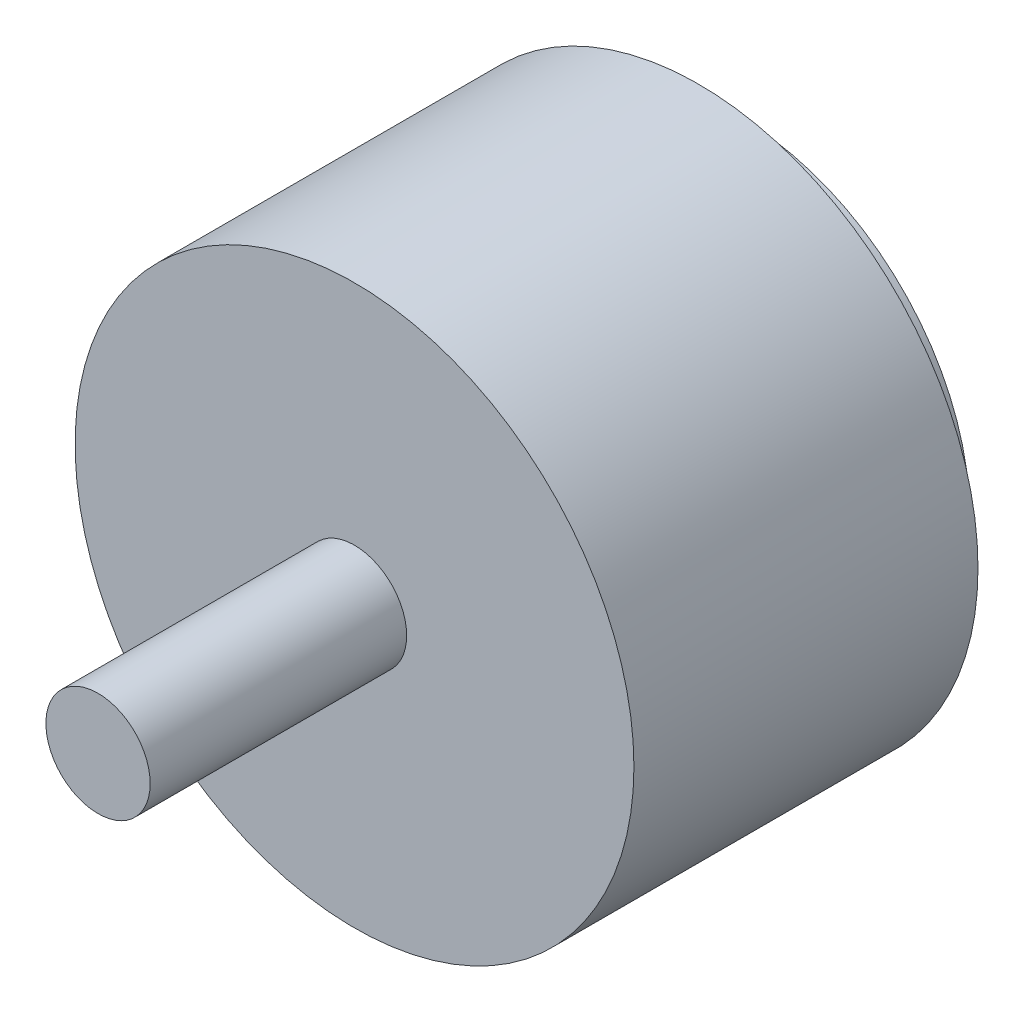
ISO-10303-21;
HEADER;
FILE_DESCRIPTION(('STEP AP214'),'2;1');
FILE_NAME('part.step','',(''),(''),'','','');
FILE_SCHEMA(('AUTOMOTIVE_DESIGN { 1 0 10303 214 1 1 1 1 }'));
ENDSEC;
DATA;
#1=APPLICATION_CONTEXT('core data for automotive mechanical design processes');
#2=APPLICATION_PROTOCOL_DEFINITION('international standard','automotive_design',2000,#1);
#3=PRODUCT_CONTEXT('',#1,'mechanical');
#4=PRODUCT('Part','Part','',(#3));
#5=PRODUCT_RELATED_PRODUCT_CATEGORY('part','',(#4));
#6=PRODUCT_DEFINITION_FORMATION('','',#4);
#7=PRODUCT_DEFINITION_CONTEXT('part definition',#1,'design');
#8=PRODUCT_DEFINITION('design','',#6,#7);
#9=PRODUCT_DEFINITION_SHAPE('','',#8);
#10=(LENGTH_UNIT() NAMED_UNIT(*) SI_UNIT(.MILLI.,.METRE.));
#11=(NAMED_UNIT(*) PLANE_ANGLE_UNIT() SI_UNIT($,.RADIAN.));
#12=(NAMED_UNIT(*) SI_UNIT($,.STERADIAN.) SOLID_ANGLE_UNIT());
#13=UNCERTAINTY_MEASURE_WITH_UNIT(LENGTH_MEASURE(1.E-05),#10,'distance_accuracy_value','');
#14=(GEOMETRIC_REPRESENTATION_CONTEXT(3) GLOBAL_UNCERTAINTY_ASSIGNED_CONTEXT((#13)) GLOBAL_UNIT_ASSIGNED_CONTEXT((#10,
#11,#12)) REPRESENTATION_CONTEXT('',''));
#15=CARTESIAN_POINT('',(0.,0.,0.));
#16=DIRECTION('',(0.,0.,1.));
#17=DIRECTION('',(1.,0.,0.));
#18=AXIS2_PLACEMENT_3D('',#15,#16,#17);
#19=CARTESIAN_POINT('',(0.,0.,16.5));
#20=DIRECTION('',(0.,0.,1.));
#21=DIRECTION('',(1.,0.,0.));
#22=AXIS2_PLACEMENT_3D('',#19,#20,#21);
#23=PLANE('',#22);
#24=CARTESIAN_POINT('',(0.,0.,16.5));
#25=DIRECTION('',(0.,0.,1.));
#26=DIRECTION('',(1.,0.,0.));
#27=AXIS2_PLACEMENT_3D('',#24,#25,#26);
#28=CIRCLE('',#27,2.5);
#29=CARTESIAN_POINT('',(2.5,0.,16.5));
#30=VERTEX_POINT('',#29);
#31=EDGE_CURVE('E10',#30,#30,#28,.T.);
#32=ORIENTED_EDGE('',*,*,#31,.F.);
#33=EDGE_LOOP('',(#32));
#34=FACE_BOUND('',#33,.T.);
#35=CARTESIAN_POINT('',(0.,0.,16.5));
#36=DIRECTION('',(0.,0.,1.));
#37=DIRECTION('',(1.,0.,0.));
#38=AXIS2_PLACEMENT_3D('',#35,#36,#37);
#39=CIRCLE('',#38,13.4);
#40=CARTESIAN_POINT('',(13.4,0.,16.5));
#41=VERTEX_POINT('',#40);
#42=EDGE_CURVE('E49',#41,#41,#39,.T.);
#43=ORIENTED_EDGE('',*,*,#42,.T.);
#44=EDGE_LOOP('',(#43));
#45=FACE_BOUND('',#44,.T.);
#46=ADVANCED_FACE('F40',(#34,#45),#23,.T.);
#47=CARTESIAN_POINT('',(0.,0.,0.));
#48=DIRECTION('',(0.,0.,1.));
#49=DIRECTION('',(1.,0.,0.));
#50=AXIS2_PLACEMENT_3D('',#47,#48,#49);
#51=PLANE('',#50);
#52=CARTESIAN_POINT('',(0.,0.,0.));
#53=DIRECTION('',(0.,0.,1.));
#54=DIRECTION('',(1.,0.,0.));
#55=AXIS2_PLACEMENT_3D('',#52,#53,#54);
#56=CIRCLE('',#55,11.);
#57=CARTESIAN_POINT('',(11.,0.,0.));
#58=VERTEX_POINT('',#57);
#59=EDGE_CURVE('E60',#58,#58,#56,.T.);
#60=ORIENTED_EDGE('',*,*,#59,.T.);
#61=EDGE_LOOP('',(#60));
#62=FACE_BOUND('',#61,.T.);
#63=CARTESIAN_POINT('',(0.,0.,0.));
#64=DIRECTION('',(0.,0.,1.));
#65=DIRECTION('',(1.,0.,0.));
#66=AXIS2_PLACEMENT_3D('',#63,#64,#65);
#67=CIRCLE('',#66,13.4);
#68=CARTESIAN_POINT('',(13.4,0.,0.));
#69=VERTEX_POINT('',#68);
#70=EDGE_CURVE('E54',#69,#69,#67,.T.);
#71=ORIENTED_EDGE('',*,*,#70,.F.);
#72=EDGE_LOOP('',(#71));
#73=FACE_BOUND('',#72,.T.);
#74=ADVANCED_FACE('F72',(#62,#73),#51,.F.);
#75=CARTESIAN_POINT('',(0.,0.,16.5));
#76=DIRECTION('',(0.,0.,-1.));
#77=DIRECTION('',(-1.,0.,0.));
#78=AXIS2_PLACEMENT_3D('',#75,#76,#77);
#79=CYLINDRICAL_SURFACE('',#78,13.4);
#80=ORIENTED_EDGE('',*,*,#42,.F.);
#81=EDGE_LOOP('',(#80));
#82=FACE_BOUND('',#81,.T.);
#83=ORIENTED_EDGE('',*,*,#70,.T.);
#84=EDGE_LOOP('',(#83));
#85=FACE_BOUND('',#84,.T.);
#86=ADVANCED_FACE('F42',(#82,#85),#79,.T.);
#87=CARTESIAN_POINT('',(0.,0.,-2.));
#88=DIRECTION('',(0.,0.,1.));
#89=DIRECTION('',(1.,0.,0.));
#90=AXIS2_PLACEMENT_3D('',#87,#88,#89);
#91=PLANE('',#90);
#92=CARTESIAN_POINT('',(-8.,0.,-2.));
#93=DIRECTION('',(0.,0.,1.));
#94=DIRECTION('',(1.,0.,0.));
#95=AXIS2_PLACEMENT_3D('',#92,#93,#94);
#96=CIRCLE('',#95,1.6);
#97=CARTESIAN_POINT('',(-6.4,0.,-2.));
#98=VERTEX_POINT('',#97);
#99=EDGE_CURVE('E148',#98,#98,#96,.T.);
#100=ORIENTED_EDGE('',*,*,#99,.T.);
#101=EDGE_LOOP('',(#100));
#102=FACE_BOUND('',#101,.T.);
#103=CARTESIAN_POINT('',(0.,-8.,-2.));
#104=DIRECTION('',(0.,0.,1.));
#105=DIRECTION('',(1.,0.,0.));
#106=AXIS2_PLACEMENT_3D('',#103,#104,#105);
#107=CIRCLE('',#106,1.6);
#108=CARTESIAN_POINT('',(1.6,-8.,-2.));
#109=VERTEX_POINT('',#108);
#110=EDGE_CURVE('E152',#109,#109,#107,.T.);
#111=ORIENTED_EDGE('',*,*,#110,.T.);
#112=EDGE_LOOP('',(#111));
#113=FACE_BOUND('',#112,.T.);
#114=CARTESIAN_POINT('',(8.,0.,-2.));
#115=DIRECTION('',(0.,0.,1.));
#116=DIRECTION('',(1.,0.,0.));
#117=AXIS2_PLACEMENT_3D('',#114,#115,#116);
#118=CIRCLE('',#117,1.6);
#119=CARTESIAN_POINT('',(9.6,0.,-2.));
#120=VERTEX_POINT('',#119);
#121=EDGE_CURVE('E160',#120,#120,#118,.T.);
#122=ORIENTED_EDGE('',*,*,#121,.T.);
#123=EDGE_LOOP('',(#122));
#124=FACE_BOUND('',#123,.T.);
#125=CARTESIAN_POINT('',(0.,8.,-2.));
#126=DIRECTION('',(0.,0.,1.));
#127=DIRECTION('',(1.,0.,0.));
#128=AXIS2_PLACEMENT_3D('',#125,#126,#127);
#129=CIRCLE('',#128,1.6);
#130=CARTESIAN_POINT('',(1.6,8.,-2.));
#131=VERTEX_POINT('',#130);
#132=EDGE_CURVE('E166',#131,#131,#129,.T.);
#133=ORIENTED_EDGE('',*,*,#132,.T.);
#134=EDGE_LOOP('',(#133));
#135=FACE_BOUND('',#134,.T.);
#136=CARTESIAN_POINT('',(0.,0.,-2.));
#137=DIRECTION('',(0.,0.,1.));
#138=DIRECTION('',(1.,0.,0.));
#139=AXIS2_PLACEMENT_3D('',#136,#137,#138);
#140=CIRCLE('',#139,11.);
#141=CARTESIAN_POINT('',(11.,0.,-2.));
#142=VERTEX_POINT('',#141);
#143=EDGE_CURVE('E63',#142,#142,#140,.T.);
#144=ORIENTED_EDGE('',*,*,#143,.F.);
#145=EDGE_LOOP('',(#144));
#146=FACE_BOUND('',#145,.T.);
#147=ADVANCED_FACE('F79',(#102,#113,#124,#135,#146),#91,.F.);
#148=CARTESIAN_POINT('',(0.,0.,0.));
#149=DIRECTION('',(0.,0.,-1.));
#150=DIRECTION('',(-1.,0.,0.));
#151=AXIS2_PLACEMENT_3D('',#148,#149,#150);
#152=CYLINDRICAL_SURFACE('',#151,11.);
#153=ORIENTED_EDGE('',*,*,#59,.F.);
#154=EDGE_LOOP('',(#153));
#155=FACE_BOUND('',#154,.T.);
#156=ORIENTED_EDGE('',*,*,#143,.T.);
#157=EDGE_LOOP('',(#156));
#158=FACE_BOUND('',#157,.T.);
#159=ADVANCED_FACE('F94',(#155,#158),#152,.T.);
#160=CARTESIAN_POINT('',(0.,0.,28.8));
#161=DIRECTION('',(0.,0.,-1.));
#162=DIRECTION('',(-1.,0.,0.));
#163=AXIS2_PLACEMENT_3D('',#160,#161,#162);
#164=CYLINDRICAL_SURFACE('',#163,2.5);
#165=CARTESIAN_POINT('',(0.,0.,28.8));
#166=DIRECTION('',(0.,0.,1.));
#167=DIRECTION('',(1.,0.,0.));
#168=AXIS2_PLACEMENT_3D('',#165,#166,#167);
#169=CIRCLE('',#168,2.5);
#170=CARTESIAN_POINT('',(2.5,0.,28.8));
#171=VERTEX_POINT('',#170);
#172=EDGE_CURVE('E58',#171,#171,#169,.T.);
#173=ORIENTED_EDGE('',*,*,#172,.F.);
#174=EDGE_LOOP('',(#173));
#175=FACE_BOUND('',#174,.T.);
#176=ORIENTED_EDGE('',*,*,#31,.T.);
#177=EDGE_LOOP('',(#176));
#178=FACE_BOUND('',#177,.T.);
#179=ADVANCED_FACE('F97',(#175,#178),#164,.T.);
#180=CARTESIAN_POINT('',(0.,0.,28.8));
#181=DIRECTION('',(0.,0.,1.));
#182=DIRECTION('',(1.,0.,0.));
#183=AXIS2_PLACEMENT_3D('',#180,#181,#182);
#184=PLANE('',#183);
#185=ORIENTED_EDGE('',*,*,#172,.T.);
#186=EDGE_LOOP('',(#185));
#187=FACE_BOUND('',#186,.T.);
#188=ADVANCED_FACE('F107',(#187),#184,.T.);
#189=CARTESIAN_POINT('',(0.,8.,3.));
#190=DIRECTION('',(0.,0.,-1.));
#191=DIRECTION('',(-1.,0.,0.));
#192=AXIS2_PLACEMENT_3D('',#189,#190,#191);
#193=CYLINDRICAL_SURFACE('',#192,1.6);
#194=CARTESIAN_POINT('',(0.,8.,3.));
#195=DIRECTION('',(0.,0.,1.));
#196=DIRECTION('',(1.,0.,0.));
#197=AXIS2_PLACEMENT_3D('',#194,#195,#196);
#198=CIRCLE('',#197,1.6);
#199=CARTESIAN_POINT('',(1.6,8.,3.));
#200=VERTEX_POINT('',#199);
#201=EDGE_CURVE('E168',#200,#200,#198,.T.);
#202=ORIENTED_EDGE('',*,*,#201,.T.);
#203=EDGE_LOOP('',(#202));
#204=FACE_BOUND('',#203,.T.);
#205=ORIENTED_EDGE('',*,*,#132,.F.);
#206=EDGE_LOOP('',(#205));
#207=FACE_BOUND('',#206,.T.);
#208=ADVANCED_FACE('F111',(#204,#207),#193,.F.);
#209=CARTESIAN_POINT('',(0.,8.,3.));
#210=DIRECTION('',(0.,0.,1.));
#211=DIRECTION('',(1.,0.,0.));
#212=AXIS2_PLACEMENT_3D('',#209,#210,#211);
#213=PLANE('',#212);
#214=ORIENTED_EDGE('',*,*,#201,.F.);
#215=EDGE_LOOP('',(#214));
#216=FACE_BOUND('',#215,.T.);
#217=ADVANCED_FACE('F113',(#216),#213,.F.);
#218=CARTESIAN_POINT('',(8.,0.,3.));
#219=DIRECTION('',(0.,0.,-1.));
#220=DIRECTION('',(-1.,0.,0.));
#221=AXIS2_PLACEMENT_3D('',#218,#219,#220);
#222=CYLINDRICAL_SURFACE('',#221,1.6);
#223=CARTESIAN_POINT('',(8.,0.,3.));
#224=DIRECTION('',(0.,0.,1.));
#225=DIRECTION('',(1.,0.,0.));
#226=AXIS2_PLACEMENT_3D('',#223,#224,#225);
#227=CIRCLE('',#226,1.6);
#228=CARTESIAN_POINT('',(9.6,0.,3.));
#229=VERTEX_POINT('',#228);
#230=EDGE_CURVE('E163',#229,#229,#227,.T.);
#231=ORIENTED_EDGE('',*,*,#230,.T.);
#232=EDGE_LOOP('',(#231));
#233=FACE_BOUND('',#232,.T.);
#234=ORIENTED_EDGE('',*,*,#121,.F.);
#235=EDGE_LOOP('',(#234));
#236=FACE_BOUND('',#235,.T.);
#237=ADVANCED_FACE('F116',(#233,#236),#222,.F.);
#238=CARTESIAN_POINT('',(8.,0.,3.));
#239=DIRECTION('',(0.,0.,1.));
#240=DIRECTION('',(1.,0.,0.));
#241=AXIS2_PLACEMENT_3D('',#238,#239,#240);
#242=PLANE('',#241);
#243=ORIENTED_EDGE('',*,*,#230,.F.);
#244=EDGE_LOOP('',(#243));
#245=FACE_BOUND('',#244,.T.);
#246=ADVANCED_FACE('F121',(#245),#242,.F.);
#247=CARTESIAN_POINT('',(0.,-8.,3.));
#248=DIRECTION('',(0.,0.,-1.));
#249=DIRECTION('',(-1.,0.,0.));
#250=AXIS2_PLACEMENT_3D('',#247,#248,#249);
#251=CYLINDRICAL_SURFACE('',#250,1.6);
#252=CARTESIAN_POINT('',(0.,-8.,3.));
#253=DIRECTION('',(0.,0.,1.));
#254=DIRECTION('',(1.,0.,0.));
#255=AXIS2_PLACEMENT_3D('',#252,#253,#254);
#256=CIRCLE('',#255,1.6);
#257=CARTESIAN_POINT('',(1.6,-8.,3.));
#258=VERTEX_POINT('',#257);
#259=EDGE_CURVE('E157',#258,#258,#256,.T.);
#260=ORIENTED_EDGE('',*,*,#259,.T.);
#261=EDGE_LOOP('',(#260));
#262=FACE_BOUND('',#261,.T.);
#263=ORIENTED_EDGE('',*,*,#110,.F.);
#264=EDGE_LOOP('',(#263));
#265=FACE_BOUND('',#264,.T.);
#266=ADVANCED_FACE('F124',(#262,#265),#251,.F.);
#267=CARTESIAN_POINT('',(0.,-8.,3.));
#268=DIRECTION('',(0.,0.,1.));
#269=DIRECTION('',(1.,0.,0.));
#270=AXIS2_PLACEMENT_3D('',#267,#268,#269);
#271=PLANE('',#270);
#272=ORIENTED_EDGE('',*,*,#259,.F.);
#273=EDGE_LOOP('',(#272));
#274=FACE_BOUND('',#273,.T.);
#275=ADVANCED_FACE('F129',(#274),#271,.F.);
#276=CARTESIAN_POINT('',(-8.,0.,3.));
#277=DIRECTION('',(0.,0.,-1.));
#278=DIRECTION('',(-1.,0.,0.));
#279=AXIS2_PLACEMENT_3D('',#276,#277,#278);
#280=CYLINDRICAL_SURFACE('',#279,1.6);
#281=CARTESIAN_POINT('',(-8.,0.,3.));
#282=DIRECTION('',(0.,0.,1.));
#283=DIRECTION('',(1.,0.,0.));
#284=AXIS2_PLACEMENT_3D('',#281,#282,#283);
#285=CIRCLE('',#284,1.6);
#286=CARTESIAN_POINT('',(-6.4,0.,3.));
#287=VERTEX_POINT('',#286);
#288=EDGE_CURVE('E147',#287,#287,#285,.T.);
#289=ORIENTED_EDGE('',*,*,#288,.T.);
#290=EDGE_LOOP('',(#289));
#291=FACE_BOUND('',#290,.T.);
#292=ORIENTED_EDGE('',*,*,#99,.F.);
#293=EDGE_LOOP('',(#292));
#294=FACE_BOUND('',#293,.T.);
#295=ADVANCED_FACE('F132',(#291,#294),#280,.F.);
#296=CARTESIAN_POINT('',(-8.,0.,3.));
#297=DIRECTION('',(0.,0.,1.));
#298=DIRECTION('',(1.,0.,0.));
#299=AXIS2_PLACEMENT_3D('',#296,#297,#298);
#300=PLANE('',#299);
#301=ORIENTED_EDGE('',*,*,#288,.F.);
#302=EDGE_LOOP('',(#301));
#303=FACE_BOUND('',#302,.T.);
#304=ADVANCED_FACE('F139',(#303),#300,.F.);
#305=CLOSED_SHELL('',(#46,#74,#86,#147,#159,#179,#188,#208,#217,#237,#246,#266,#275,#295,#304));
#306=CARTESIAN_POINT('',(0.,0.,0.));
#307=DIRECTION('',(0.,0.,1.));
#308=DIRECTION('',(1.,0.,0.));
#309=AXIS2_PLACEMENT_3D('',#306,#307,#308);
#310=PLANE('',#309);
#311=CARTESIAN_POINT('',(0.,0.,0.));
#312=DIRECTION('',(0.,0.,1.));
#313=DIRECTION('',(1.,0.,0.));
#314=AXIS2_PLACEMENT_3D('',#311,#312,#313);
#315=CIRCLE('',#314,4.5);
#316=CARTESIAN_POINT('',(4.5,0.,0.));
#317=VERTEX_POINT('',#316);
#318=EDGE_CURVE('E66',#317,#317,#315,.T.);
#319=ORIENTED_EDGE('',*,*,#318,.T.);
#320=EDGE_LOOP('',(#319));
#321=FACE_BOUND('',#320,.T.);
#322=ADVANCED_FACE('F92',(#321),#310,.T.);
#323=CARTESIAN_POINT('',(0.,0.,15.));
#324=DIRECTION('',(0.,0.,1.));
#325=DIRECTION('',(1.,0.,0.));
#326=AXIS2_PLACEMENT_3D('',#323,#324,#325);
#327=PLANE('',#326);
#328=CARTESIAN_POINT('',(0.,0.,15.));
#329=DIRECTION('',(0.,0.,1.));
#330=DIRECTION('',(1.,0.,0.));
#331=AXIS2_PLACEMENT_3D('',#328,#329,#330);
#332=CIRCLE('',#331,4.5);
#333=CARTESIAN_POINT('',(4.5,0.,15.));
#334=VERTEX_POINT('',#333);
#335=EDGE_CURVE('E44',#334,#334,#332,.T.);
#336=ORIENTED_EDGE('',*,*,#335,.F.);
#337=EDGE_LOOP('',(#336));
#338=FACE_BOUND('',#337,.T.);
#339=ADVANCED_FACE('F87',(#338),#327,.F.);
#340=CARTESIAN_POINT('',(0.,0.,16.5));
#341=DIRECTION('',(0.,0.,-1.));
#342=DIRECTION('',(-1.,0.,0.));
#343=AXIS2_PLACEMENT_3D('',#340,#341,#342);
#344=CYLINDRICAL_SURFACE('',#343,4.5);
#345=ORIENTED_EDGE('',*,*,#318,.F.);
#346=EDGE_LOOP('',(#345));
#347=FACE_BOUND('',#346,.T.);
#348=ORIENTED_EDGE('',*,*,#335,.T.);
#349=EDGE_LOOP('',(#348));
#350=FACE_BOUND('',#349,.T.);
#351=ADVANCED_FACE('F84',(#347,#350),#344,.F.);
#352=CLOSED_SHELL('',(#322,#339,#351));
#353=ORIENTED_CLOSED_SHELL('',*,#352,.T.);
#354=BREP_WITH_VOIDS('B2',#305,(#353));
#355=ADVANCED_BREP_SHAPE_REPRESENTATION('',(#18,#354),#14);
#356=SHAPE_DEFINITION_REPRESENTATION(#9,#355);
ENDSEC;
END-ISO-10303-21;
